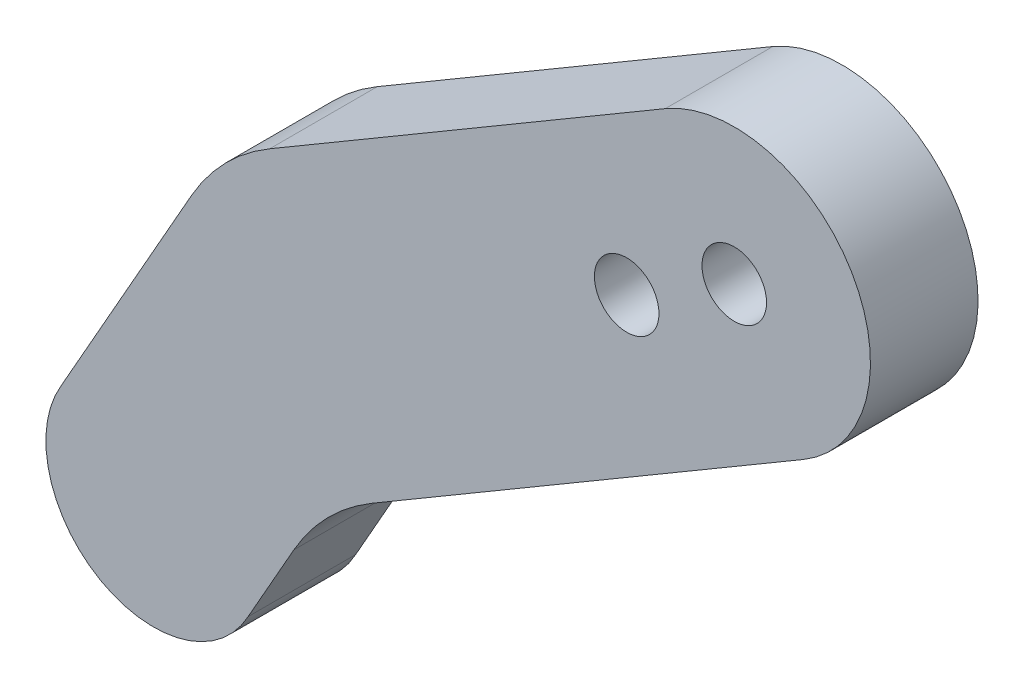
ISO-10303-21;
HEADER;
FILE_DESCRIPTION(('STEP AP214'),'2;1');
FILE_NAME('part.step','',(''),(''),'','','');
FILE_SCHEMA(('AUTOMOTIVE_DESIGN { 1 0 10303 214 1 1 1 1 }'));
ENDSEC;
DATA;
#1=APPLICATION_CONTEXT('core data for automotive mechanical design processes');
#2=APPLICATION_PROTOCOL_DEFINITION('international standard','automotive_design',2000,#1);
#3=PRODUCT_CONTEXT('',#1,'mechanical');
#4=PRODUCT('Part','Part','',(#3));
#5=PRODUCT_RELATED_PRODUCT_CATEGORY('part','',(#4));
#6=PRODUCT_DEFINITION_FORMATION('','',#4);
#7=PRODUCT_DEFINITION_CONTEXT('part definition',#1,'design');
#8=PRODUCT_DEFINITION('design','',#6,#7);
#9=PRODUCT_DEFINITION_SHAPE('','',#8);
#10=(LENGTH_UNIT() NAMED_UNIT(*) SI_UNIT(.MILLI.,.METRE.));
#11=(NAMED_UNIT(*) PLANE_ANGLE_UNIT() SI_UNIT($,.RADIAN.));
#12=(NAMED_UNIT(*) SI_UNIT($,.STERADIAN.) SOLID_ANGLE_UNIT());
#13=UNCERTAINTY_MEASURE_WITH_UNIT(LENGTH_MEASURE(1.E-05),#10,'distance_accuracy_value','');
#14=(GEOMETRIC_REPRESENTATION_CONTEXT(3) GLOBAL_UNCERTAINTY_ASSIGNED_CONTEXT((#13)) GLOBAL_UNIT_ASSIGNED_CONTEXT((#10,
#11,#12)) REPRESENTATION_CONTEXT('',''));
#15=CARTESIAN_POINT('',(0.,0.,0.));
#16=DIRECTION('',(0.,0.,1.));
#17=DIRECTION('',(1.,0.,0.));
#18=AXIS2_PLACEMENT_3D('',#15,#16,#17);
#19=CARTESIAN_POINT('',(8.69918007203384,-4.93196371380907,5.));
#20=DIRECTION('',(-0.869918007203384,0.493196371380907,0.));
#21=DIRECTION('',(-0.493196371380907,-0.869918007203384,0.));
#22=AXIS2_PLACEMENT_3D('',#19,#20,#21);
#23=PLANE('',#22);
#24=DIRECTION('',(0.493196371380907,0.869918007203384,0.));
#25=VECTOR('',#24,1.);
#26=CARTESIAN_POINT('',(8.69918007203384,-4.93196371380907,0.));
#27=LINE('',#26,#25);
#28=CARTESIAN_POINT('',(8.69918007203384,-4.93196371380907,0.));
#29=VERTEX_POINT('',#28);
#30=CARTESIAN_POINT('',(10.8300389774854,-1.17347593849977,0.));
#31=VERTEX_POINT('',#30);
#32=EDGE_CURVE('E132',#29,#31,#27,.T.);
#33=ORIENTED_EDGE('',*,*,#32,.T.);
#34=DIRECTION('',(0.,0.,-1.));
#35=VECTOR('',#34,1.);
#36=CARTESIAN_POINT('',(10.8300389774854,-1.17347593849977,5.));
#37=LINE('',#36,#35);
#38=CARTESIAN_POINT('',(10.8300389774854,-1.17347593849977,5.));
#39=VERTEX_POINT('',#38);
#40=EDGE_CURVE('E11',#39,#31,#37,.T.);
#41=ORIENTED_EDGE('',*,*,#40,.F.);
#42=DIRECTION('',(0.493196371380907,0.869918007203384,0.));
#43=VECTOR('',#42,1.);
#44=CARTESIAN_POINT('',(8.69918007203384,-4.93196371380907,5.));
#45=LINE('',#44,#43);
#46=CARTESIAN_POINT('',(8.69918007203384,-4.93196371380907,5.));
#47=VERTEX_POINT('',#46);
#48=EDGE_CURVE('E151',#47,#39,#45,.T.);
#49=ORIENTED_EDGE('',*,*,#48,.F.);
#50=DIRECTION('',(0.,0.,-1.));
#51=VECTOR('',#50,1.);
#52=CARTESIAN_POINT('',(8.69918007203384,-4.93196371380907,5.));
#53=LINE('',#52,#51);
#54=EDGE_CURVE('E128',#47,#29,#53,.T.);
#55=ORIENTED_EDGE('',*,*,#54,.T.);
#56=EDGE_LOOP('',(#33,#41,#49,#55));
#57=FACE_BOUND('',#56,.T.);
#58=ADVANCED_FACE('F35',(#57),#23,.F.);
#59=CARTESIAN_POINT('',(19.5292190495193,-6.10543965230884,5.));
#60=DIRECTION('',(0.,0.,-1.));
#61=DIRECTION('',(-1.,0.,0.));
#62=AXIS2_PLACEMENT_3D('',#59,#60,#61);
#63=CYLINDRICAL_SURFACE('',#62,10.);
#64=CARTESIAN_POINT('',(19.5292190495193,-6.10543965230884,0.));
#65=DIRECTION('',(0.,0.,1.));
#66=DIRECTION('',(1.,0.,0.));
#67=AXIS2_PLACEMENT_3D('',#64,#65,#66);
#68=CIRCLE('',#67,10.);
#69=CARTESIAN_POINT('',(14.4614899719472,2.51535625040978,0.));
#70=VERTEX_POINT('',#69);
#71=EDGE_CURVE('E135',#31,#70,#68,.F.);
#72=ORIENTED_EDGE('',*,*,#71,.T.);
#73=DIRECTION('',(0.,0.,-1.));
#74=VECTOR('',#73,1.);
#75=CARTESIAN_POINT('',(14.4614899719472,2.51535625040978,5.));
#76=LINE('',#75,#74);
#77=CARTESIAN_POINT('',(14.4614899719472,2.51535625040978,5.));
#78=VERTEX_POINT('',#77);
#79=EDGE_CURVE('E44',#78,#70,#76,.T.);
#80=ORIENTED_EDGE('',*,*,#79,.F.);
#81=CARTESIAN_POINT('',(19.5292190495193,-6.10543965230884,5.));
#82=DIRECTION('',(0.,0.,1.));
#83=DIRECTION('',(1.,0.,0.));
#84=AXIS2_PLACEMENT_3D('',#81,#82,#83);
#85=CIRCLE('',#84,10.);
#86=EDGE_CURVE('E92',#39,#78,#85,.F.);
#87=ORIENTED_EDGE('',*,*,#86,.F.);
#88=ORIENTED_EDGE('',*,*,#40,.T.);
#89=EDGE_LOOP('',(#72,#80,#87,#88));
#90=FACE_BOUND('',#89,.T.);
#91=ADVANCED_FACE('F201',(#90),#63,.F.);
#92=CARTESIAN_POINT('',(2.61507694352429,-4.44854968664361,5.));
#93=DIRECTION('',(-0.506772907757211,0.862079590271862,0.));
#94=DIRECTION('',(-0.862079590271862,-0.506772907757211,0.));
#95=AXIS2_PLACEMENT_3D('',#92,#93,#94);
#96=PLANE('',#95);
#97=DIRECTION('',(0.862079590271862,0.506772907757211,0.));
#98=VECTOR('',#97,1.);
#99=CARTESIAN_POINT('',(2.61507694352429,-4.44854968664361,0.));
#100=LINE('',#99,#98);
#101=CARTESIAN_POINT('',(34.5037294889417,14.2971732805412,0.));
#102=VERTEX_POINT('',#101);
#103=EDGE_CURVE('E138',#70,#102,#100,.T.);
#104=ORIENTED_EDGE('',*,*,#103,.T.);
#105=DIRECTION('',(0.,0.,-1.));
#106=VECTOR('',#105,1.);
#107=CARTESIAN_POINT('',(34.5037294889417,14.2971732805412,5.));
#108=LINE('',#107,#106);
#109=CARTESIAN_POINT('',(34.5037294889417,14.2971732805412,5.));
#110=VERTEX_POINT('',#109);
#111=EDGE_CURVE('E157',#110,#102,#108,.T.);
#112=ORIENTED_EDGE('',*,*,#111,.F.);
#113=DIRECTION('',(0.862079590271862,0.506772907757211,0.));
#114=VECTOR('',#113,1.);
#115=CARTESIAN_POINT('',(2.61507694352429,-4.44854968664361,5.));
#116=LINE('',#115,#114);
#117=EDGE_CURVE('E174',#78,#110,#116,.T.);
#118=ORIENTED_EDGE('',*,*,#117,.F.);
#119=ORIENTED_EDGE('',*,*,#79,.T.);
#120=EDGE_LOOP('',(#104,#112,#118,#119));
#121=FACE_BOUND('',#120,.T.);
#122=ADVANCED_FACE('F205',(#121),#96,.F.);
#123=CARTESIAN_POINT('',(31.29579261309,19.7542465873825,5.));
#124=DIRECTION('',(0.,0.,-1.));
#125=DIRECTION('',(-1.,0.,0.));
#126=AXIS2_PLACEMENT_3D('',#123,#124,#125);
#127=CYLINDRICAL_SURFACE('',#126,6.3301270189222);
#128=CARTESIAN_POINT('',(31.29579261309,19.7542465873825,0.));
#129=DIRECTION('',(0.,0.,1.));
#130=DIRECTION('',(1.,0.,0.));
#131=AXIS2_PLACEMENT_3D('',#128,#129,#130);
#132=CIRCLE('',#131,6.3301270189222);
#133=CARTESIAN_POINT('',(28.0878557372383,25.2113198942238,0.));
#134=VERTEX_POINT('',#133);
#135=EDGE_CURVE('E141',#134,#102,#132,.F.);
#136=ORIENTED_EDGE('',*,*,#135,.F.);
#137=DIRECTION('',(0.,0.,-1.));
#138=VECTOR('',#137,1.);
#139=CARTESIAN_POINT('',(28.0878557372383,25.2113198942238,5.));
#140=LINE('',#139,#138);
#141=CARTESIAN_POINT('',(28.0878557372383,25.2113198942238,5.));
#142=VERTEX_POINT('',#141);
#143=EDGE_CURVE('E155',#142,#134,#140,.T.);
#144=ORIENTED_EDGE('',*,*,#143,.F.);
#145=CARTESIAN_POINT('',(31.29579261309,19.7542465873825,5.));
#146=DIRECTION('',(0.,0.,1.));
#147=DIRECTION('',(1.,0.,0.));
#148=AXIS2_PLACEMENT_3D('',#145,#146,#147);
#149=CIRCLE('',#148,6.3301270189222);
#150=EDGE_CURVE('E176',#142,#110,#149,.F.);
#151=ORIENTED_EDGE('',*,*,#150,.T.);
#152=ORIENTED_EDGE('',*,*,#111,.T.);
#153=EDGE_LOOP('',(#136,#144,#151,#152));
#154=FACE_BOUND('',#153,.T.);
#155=ADVANCED_FACE('F209',(#154),#127,.T.);
#156=CARTESIAN_POINT('',(-3.80079680817908,6.46559692703897,5.));
#157=DIRECTION('',(-0.50677290775721,0.862079590271862,0.));
#158=DIRECTION('',(-0.862079590271862,-0.50677290775721,0.));
#159=AXIS2_PLACEMENT_3D('',#156,#157,#158);
#160=PLANE('',#159);
#161=DIRECTION('',(0.862079590271862,0.506772907757211,0.));
#162=VECTOR('',#161,1.);
#163=CARTESIAN_POINT('',(-3.80079680817908,6.46559692703897,0.));
#164=LINE('',#163,#162);
#165=CARTESIAN_POINT('',(9.7078808709606,14.4066640218459,0.));
#166=VERTEX_POINT('',#165);
#167=EDGE_CURVE('E144',#166,#134,#164,.T.);
#168=ORIENTED_EDGE('',*,*,#167,.F.);
#169=DIRECTION('',(0.,0.,-1.));
#170=VECTOR('',#169,1.);
#171=CARTESIAN_POINT('',(9.7078808709606,14.4066640218459,5.));
#172=LINE('',#171,#170);
#173=CARTESIAN_POINT('',(9.7078808709606,14.4066640218459,5.));
#174=VERTEX_POINT('',#173);
#175=EDGE_CURVE('E117',#174,#166,#172,.T.);
#176=ORIENTED_EDGE('',*,*,#175,.F.);
#177=DIRECTION('',(0.862079590271862,0.506772907757211,0.));
#178=VECTOR('',#177,1.);
#179=CARTESIAN_POINT('',(-3.80079680817908,6.46559692703897,5.));
#180=LINE('',#179,#178);
#181=EDGE_CURVE('E124',#174,#142,#180,.T.);
#182=ORIENTED_EDGE('',*,*,#181,.T.);
#183=ORIENTED_EDGE('',*,*,#143,.T.);
#184=EDGE_LOOP('',(#168,#176,#182,#183));
#185=FACE_BOUND('',#184,.T.);
#186=ADVANCED_FACE('F180',(#185),#160,.T.);
#187=CARTESIAN_POINT('',(14.7756099485327,5.7858681191273,5.));
#188=DIRECTION('',(0.,0.,-1.));
#189=DIRECTION('',(-1.,0.,0.));
#190=AXIS2_PLACEMENT_3D('',#187,#188,#189);
#191=CYLINDRICAL_SURFACE('',#190,10.);
#192=CARTESIAN_POINT('',(14.7756099485327,5.7858681191273,0.));
#193=DIRECTION('',(0.,0.,1.));
#194=DIRECTION('',(1.,0.,0.));
#195=AXIS2_PLACEMENT_3D('',#192,#193,#194);
#196=CIRCLE('',#195,10.);
#197=CARTESIAN_POINT('',(6.07642987649886,10.7178318329364,0.));
#198=VERTEX_POINT('',#197);
#199=EDGE_CURVE('E112',#198,#166,#196,.F.);
#200=ORIENTED_EDGE('',*,*,#199,.F.);
#201=DIRECTION('',(0.,0.,-1.));
#202=VECTOR('',#201,1.);
#203=CARTESIAN_POINT('',(6.07642987649886,10.7178318329364,5.));
#204=LINE('',#203,#202);
#205=CARTESIAN_POINT('',(6.07642987649886,10.7178318329364,5.));
#206=VERTEX_POINT('',#205);
#207=EDGE_CURVE('E107',#206,#198,#204,.T.);
#208=ORIENTED_EDGE('',*,*,#207,.F.);
#209=CARTESIAN_POINT('',(14.7756099485327,5.7858681191273,5.));
#210=DIRECTION('',(0.,0.,1.));
#211=DIRECTION('',(1.,0.,0.));
#212=AXIS2_PLACEMENT_3D('',#209,#210,#211);
#213=CIRCLE('',#212,10.);
#214=EDGE_CURVE('E110',#206,#174,#213,.F.);
#215=ORIENTED_EDGE('',*,*,#214,.T.);
#216=ORIENTED_EDGE('',*,*,#175,.T.);
#217=EDGE_LOOP('',(#200,#208,#215,#216));
#218=FACE_BOUND('',#217,.T.);
#219=ADVANCED_FACE('F109',(#218),#191,.T.);
#220=CARTESIAN_POINT('',(0.,0.,5.));
#221=DIRECTION('',(-0.869918007203384,0.493196371380907,0.));
#222=DIRECTION('',(-0.493196371380907,-0.869918007203384,0.));
#223=AXIS2_PLACEMENT_3D('',#220,#221,#222);
#224=PLANE('',#223);
#225=DIRECTION('',(0.493196371380907,0.869918007203384,0.));
#226=VECTOR('',#225,1.);
#227=CARTESIAN_POINT('',(0.,0.,0.));
#228=LINE('',#227,#226);
#229=CARTESIAN_POINT('',(0.,0.,0.));
#230=VERTEX_POINT('',#229);
#231=EDGE_CURVE('E148',#230,#198,#228,.T.);
#232=ORIENTED_EDGE('',*,*,#231,.F.);
#233=DIRECTION('',(0.,0.,-1.));
#234=VECTOR('',#233,1.);
#235=CARTESIAN_POINT('',(0.,0.,5.));
#236=LINE('',#235,#234);
#237=CARTESIAN_POINT('',(0.,0.,5.));
#238=VERTEX_POINT('',#237);
#239=EDGE_CURVE('E81',#238,#230,#236,.T.);
#240=ORIENTED_EDGE('',*,*,#239,.F.);
#241=DIRECTION('',(0.493196371380907,0.869918007203384,0.));
#242=VECTOR('',#241,1.);
#243=CARTESIAN_POINT('',(0.,0.,5.));
#244=LINE('',#243,#242);
#245=EDGE_CURVE('E121',#238,#206,#244,.T.);
#246=ORIENTED_EDGE('',*,*,#245,.T.);
#247=ORIENTED_EDGE('',*,*,#207,.T.);
#248=EDGE_LOOP('',(#232,#240,#246,#247));
#249=FACE_BOUND('',#248,.T.);
#250=ADVANCED_FACE('F126',(#249),#224,.T.);
#251=CARTESIAN_POINT('',(4.30532765313558,-2.54405348545767,5.));
#252=DIRECTION('',(0.,0.,-1.));
#253=DIRECTION('',(-1.,0.,0.));
#254=AXIS2_PLACEMENT_3D('',#251,#252,#253);
#255=CYLINDRICAL_SURFACE('',#254,5.00080536891042);
#256=CARTESIAN_POINT('',(4.30532765313558,-2.54405348545767,0.));
#257=DIRECTION('',(0.,0.,1.));
#258=DIRECTION('',(1.,0.,0.));
#259=AXIS2_PLACEMENT_3D('',#256,#257,#258);
#260=CIRCLE('',#259,5.00080536891042);
#261=EDGE_CURVE('E84',#230,#29,#260,.T.);
#262=ORIENTED_EDGE('',*,*,#261,.T.);
#263=ORIENTED_EDGE('',*,*,#54,.F.);
#264=CARTESIAN_POINT('',(4.30532765313558,-2.54405348545767,5.));
#265=DIRECTION('',(0.,0.,1.));
#266=DIRECTION('',(1.,0.,0.));
#267=AXIS2_PLACEMENT_3D('',#264,#265,#266);
#268=CIRCLE('',#267,5.00080536891042);
#269=EDGE_CURVE('E53',#238,#47,#268,.T.);
#270=ORIENTED_EDGE('',*,*,#269,.F.);
#271=ORIENTED_EDGE('',*,*,#239,.T.);
#272=EDGE_LOOP('',(#262,#263,#270,#271));
#273=FACE_BOUND('',#272,.T.);
#274=ADVANCED_FACE('F189',(#273),#255,.T.);
#275=CARTESIAN_POINT('',(0.,0.,5.));
#276=DIRECTION('',(0.,0.,1.));
#277=DIRECTION('',(1.,0.,0.));
#278=AXIS2_PLACEMENT_3D('',#275,#276,#277);
#279=PLANE('',#278);
#280=CARTESIAN_POINT('',(26.29579261309,16.8149999477689,5.));
#281=DIRECTION('',(0.,0.,1.));
#282=DIRECTION('',(1.,0.,0.));
#283=AXIS2_PLACEMENT_3D('',#280,#281,#282);
#284=CIRCLE('',#283,1.5);
#285=CARTESIAN_POINT('',(27.79579261309,16.8149999477689,5.));
#286=VERTEX_POINT('',#285);
#287=EDGE_CURVE('E169',#286,#286,#284,.T.);
#288=ORIENTED_EDGE('',*,*,#287,.F.);
#289=EDGE_LOOP('',(#288));
#290=FACE_BOUND('',#289,.T.);
#291=CARTESIAN_POINT('',(31.29579261309,19.7542465873825,5.));
#292=DIRECTION('',(0.,0.,1.));
#293=DIRECTION('',(1.,0.,0.));
#294=AXIS2_PLACEMENT_3D('',#291,#292,#293);
#295=CIRCLE('',#294,1.5);
#296=CARTESIAN_POINT('',(32.79579261309,19.7542465873825,5.));
#297=VERTEX_POINT('',#296);
#298=EDGE_CURVE('E161',#297,#297,#295,.T.);
#299=ORIENTED_EDGE('',*,*,#298,.F.);
#300=EDGE_LOOP('',(#299));
#301=FACE_BOUND('',#300,.T.);
#302=ORIENTED_EDGE('',*,*,#48,.T.);
#303=ORIENTED_EDGE('',*,*,#86,.T.);
#304=ORIENTED_EDGE('',*,*,#117,.T.);
#305=ORIENTED_EDGE('',*,*,#150,.F.);
#306=ORIENTED_EDGE('',*,*,#181,.F.);
#307=ORIENTED_EDGE('',*,*,#214,.F.);
#308=ORIENTED_EDGE('',*,*,#245,.F.);
#309=ORIENTED_EDGE('',*,*,#269,.T.);
#310=EDGE_LOOP('',(#302,#303,#304,#305,#306,#307,#308,#309));
#311=FACE_BOUND('',#310,.T.);
#312=ADVANCED_FACE('F120',(#290,#301,#311),#279,.T.);
#313=CARTESIAN_POINT('',(0.,0.,0.));
#314=DIRECTION('',(0.,0.,1.));
#315=DIRECTION('',(1.,0.,0.));
#316=AXIS2_PLACEMENT_3D('',#313,#314,#315);
#317=PLANE('',#316);
#318=CARTESIAN_POINT('',(26.29579261309,16.8149999477689,0.));
#319=DIRECTION('',(0.,0.,1.));
#320=DIRECTION('',(1.,0.,0.));
#321=AXIS2_PLACEMENT_3D('',#318,#319,#320);
#322=CIRCLE('',#321,1.5);
#323=CARTESIAN_POINT('',(27.79579261309,16.8149999477689,0.));
#324=VERTEX_POINT('',#323);
#325=EDGE_CURVE('E38',#324,#324,#322,.T.);
#326=ORIENTED_EDGE('',*,*,#325,.T.);
#327=EDGE_LOOP('',(#326));
#328=FACE_BOUND('',#327,.T.);
#329=CARTESIAN_POINT('',(31.29579261309,19.7542465873825,0.));
#330=DIRECTION('',(0.,0.,1.));
#331=DIRECTION('',(1.,0.,0.));
#332=AXIS2_PLACEMENT_3D('',#329,#330,#331);
#333=CIRCLE('',#332,1.5);
#334=CARTESIAN_POINT('',(32.79579261309,19.7542465873825,0.));
#335=VERTEX_POINT('',#334);
#336=EDGE_CURVE('E136',#335,#335,#333,.T.);
#337=ORIENTED_EDGE('',*,*,#336,.T.);
#338=EDGE_LOOP('',(#337));
#339=FACE_BOUND('',#338,.T.);
#340=ORIENTED_EDGE('',*,*,#32,.F.);
#341=ORIENTED_EDGE('',*,*,#261,.F.);
#342=ORIENTED_EDGE('',*,*,#231,.T.);
#343=ORIENTED_EDGE('',*,*,#199,.T.);
#344=ORIENTED_EDGE('',*,*,#167,.T.);
#345=ORIENTED_EDGE('',*,*,#135,.T.);
#346=ORIENTED_EDGE('',*,*,#103,.F.);
#347=ORIENTED_EDGE('',*,*,#71,.F.);
#348=EDGE_LOOP('',(#340,#341,#342,#343,#344,#345,#346,#347));
#349=FACE_BOUND('',#348,.T.);
#350=ADVANCED_FACE('F184',(#328,#339,#349),#317,.F.);
#351=CARTESIAN_POINT('',(31.29579261309,19.7542465873825,-2.));
#352=DIRECTION('',(0.,0.,1.));
#353=DIRECTION('',(1.,0.,0.));
#354=AXIS2_PLACEMENT_3D('',#351,#352,#353);
#355=CYLINDRICAL_SURFACE('',#354,1.5);
#356=ORIENTED_EDGE('',*,*,#298,.T.);
#357=EDGE_LOOP('',(#356));
#358=FACE_BOUND('',#357,.T.);
#359=ORIENTED_EDGE('',*,*,#336,.F.);
#360=EDGE_LOOP('',(#359));
#361=FACE_BOUND('',#360,.T.);
#362=ADVANCED_FACE('F246',(#358,#361),#355,.F.);
#363=CARTESIAN_POINT('',(26.29579261309,16.8149999477689,-2.));
#364=DIRECTION('',(0.,0.,1.));
#365=DIRECTION('',(1.,0.,0.));
#366=AXIS2_PLACEMENT_3D('',#363,#364,#365);
#367=CYLINDRICAL_SURFACE('',#366,1.5);
#368=ORIENTED_EDGE('',*,*,#287,.T.);
#369=EDGE_LOOP('',(#368));
#370=FACE_BOUND('',#369,.T.);
#371=ORIENTED_EDGE('',*,*,#325,.F.);
#372=EDGE_LOOP('',(#371));
#373=FACE_BOUND('',#372,.T.);
#374=ADVANCED_FACE('F255',(#370,#373),#367,.F.);
#375=CLOSED_SHELL('',(#58,#91,#122,#155,#186,#219,#250,#274,#312,#350,#362,#374));
#376=MANIFOLD_SOLID_BREP('B2',#375);
#377=ADVANCED_BREP_SHAPE_REPRESENTATION('',(#18,#376),#14);
#378=SHAPE_DEFINITION_REPRESENTATION(#9,#377);
ENDSEC;
END-ISO-10303-21;
